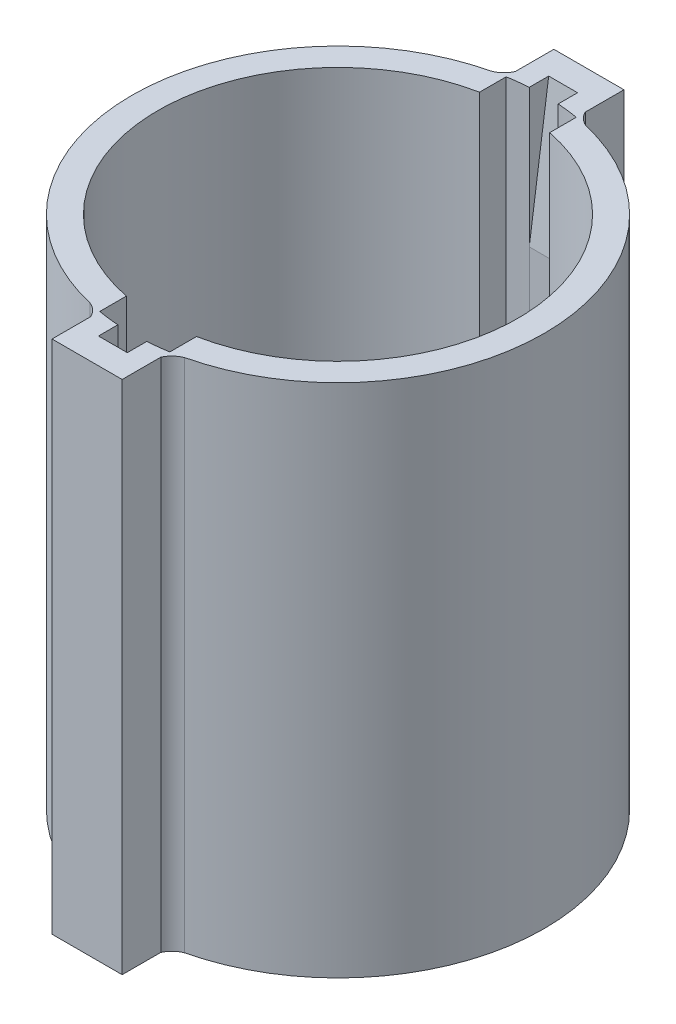
ISO-10303-21;
HEADER;
FILE_DESCRIPTION(('STEP AP214'),'2;1');
FILE_NAME('part.step','',(''),(''),'','','');
FILE_SCHEMA(('AUTOMOTIVE_DESIGN { 1 0 10303 214 1 1 1 1 }'));
ENDSEC;
DATA;
#1=APPLICATION_CONTEXT('core data for automotive mechanical design processes');
#2=APPLICATION_PROTOCOL_DEFINITION('international standard','automotive_design',2000,#1);
#3=PRODUCT_CONTEXT('',#1,'mechanical');
#4=PRODUCT('Part','Part','',(#3));
#5=PRODUCT_RELATED_PRODUCT_CATEGORY('part','',(#4));
#6=PRODUCT_DEFINITION_FORMATION('','',#4);
#7=PRODUCT_DEFINITION_CONTEXT('part definition',#1,'design');
#8=PRODUCT_DEFINITION('design','',#6,#7);
#9=PRODUCT_DEFINITION_SHAPE('','',#8);
#10=(LENGTH_UNIT() NAMED_UNIT(*) SI_UNIT(.MILLI.,.METRE.));
#11=(NAMED_UNIT(*) PLANE_ANGLE_UNIT() SI_UNIT($,.RADIAN.));
#12=(NAMED_UNIT(*) SI_UNIT($,.STERADIAN.) SOLID_ANGLE_UNIT());
#13=UNCERTAINTY_MEASURE_WITH_UNIT(LENGTH_MEASURE(1.E-05),#10,'distance_accuracy_value','');
#14=(GEOMETRIC_REPRESENTATION_CONTEXT(3) GLOBAL_UNCERTAINTY_ASSIGNED_CONTEXT((#13)) GLOBAL_UNIT_ASSIGNED_CONTEXT((#10,
#11,#12)) REPRESENTATION_CONTEXT('',''));
#15=CARTESIAN_POINT('',(0.,0.,0.));
#16=DIRECTION('',(0.,0.,1.));
#17=DIRECTION('',(1.,0.,0.));
#18=AXIS2_PLACEMENT_3D('',#15,#16,#17);
#19=CARTESIAN_POINT('',(-1.4,50.,0.));
#20=DIRECTION('',(1.,0.,0.));
#21=DIRECTION('',(0.,0.,-1.));
#22=AXIS2_PLACEMENT_3D('',#19,#20,#21);
#23=PLANE('',#22);
#24=DIRECTION('',(0.,-1.,0.));
#25=VECTOR('',#24,1.);
#26=CARTESIAN_POINT('',(-1.4,50.,-19.9509398274868));
#27=LINE('',#26,#25);
#28=CARTESIAN_POINT('',(-1.4,50.,-19.9509398274868));
#29=VERTEX_POINT('',#28);
#30=CARTESIAN_POINT('',(-1.4,36.5942152933488,-19.9509398274868));
#31=VERTEX_POINT('',#30);
#32=EDGE_CURVE('E369',#29,#31,#27,.T.);
#33=ORIENTED_EDGE('',*,*,#32,.T.);
#34=DIRECTION('',(0.,-0.990268068741572,0.139173100960055));
#35=VECTOR('',#34,1.);
#36=CARTESIAN_POINT('',(-1.4,-2.04081323058998,-14.5211406699822));
#37=LINE('',#36,#35);
#38=CARTESIAN_POINT('',(-1.4,50.,-21.835));
#39=VERTEX_POINT('',#38);
#40=EDGE_CURVE('E510',#39,#31,#37,.T.);
#41=ORIENTED_EDGE('',*,*,#40,.F.);
#42=DIRECTION('',(0.,0.,1.));
#43=VECTOR('',#42,1.);
#44=CARTESIAN_POINT('',(-1.4,50.,0.));
#45=LINE('',#44,#43);
#46=EDGE_CURVE('E411',#39,#29,#45,.T.);
#47=ORIENTED_EDGE('',*,*,#46,.T.);
#48=EDGE_LOOP('',(#33,#41,#47));
#49=FACE_BOUND('',#48,.T.);
#50=ADVANCED_FACE('F45',(#49),#23,.T.);
#51=CARTESIAN_POINT('',(1.4,50.,0.));
#52=DIRECTION('',(1.,0.,0.));
#53=DIRECTION('',(0.,0.,-1.));
#54=AXIS2_PLACEMENT_3D('',#51,#52,#53);
#55=PLANE('',#54);
#56=DIRECTION('',(0.,-0.990268068741572,0.139173100960055));
#57=VECTOR('',#56,1.);
#58=CARTESIAN_POINT('',(1.4,-2.04081323058998,-14.5211406699822));
#59=LINE('',#58,#57);
#60=CARTESIAN_POINT('',(1.4,50.,-21.835));
#61=VERTEX_POINT('',#60);
#62=CARTESIAN_POINT('',(1.4,36.5942152933488,-19.9509398274868));
#63=VERTEX_POINT('',#62);
#64=EDGE_CURVE('E471',#61,#63,#59,.T.);
#65=ORIENTED_EDGE('',*,*,#64,.T.);
#66=DIRECTION('',(0.,-1.,0.));
#67=VECTOR('',#66,1.);
#68=CARTESIAN_POINT('',(1.4,50.,-19.9509398274868));
#69=LINE('',#68,#67);
#70=CARTESIAN_POINT('',(1.4,50.,-19.9509398274868));
#71=VERTEX_POINT('',#70);
#72=EDGE_CURVE('E365',#71,#63,#69,.T.);
#73=ORIENTED_EDGE('',*,*,#72,.F.);
#74=DIRECTION('',(0.,0.,1.));
#75=VECTOR('',#74,1.);
#76=CARTESIAN_POINT('',(1.4,50.,0.));
#77=LINE('',#76,#75);
#78=EDGE_CURVE('E446',#61,#71,#77,.T.);
#79=ORIENTED_EDGE('',*,*,#78,.F.);
#80=EDGE_LOOP('',(#65,#73,#79));
#81=FACE_BOUND('',#80,.T.);
#82=ADVANCED_FACE('F470',(#81),#55,.F.);
#83=CARTESIAN_POINT('',(5.37543644040511,50.,-21.492012876502));
#84=DIRECTION('',(0.,-1.,0.));
#85=DIRECTION('',(0.,0.,-1.));
#86=AXIS2_PLACEMENT_3D('',#83,#84,#85);
#87=CYLINDRICAL_SURFACE('',#86,2.17157334339546);
#88=CARTESIAN_POINT('',(5.37543644040511,0.,-21.492012876502));
#89=DIRECTION('',(0.,1.,0.));
#90=DIRECTION('',(0.,0.,1.));
#91=AXIS2_PLACEMENT_3D('',#88,#89,#90);
#92=CIRCLE('',#91,2.17157334339546);
#93=CARTESIAN_POINT('',(3.4,0.,-20.5901361356636));
#94=VERTEX_POINT('',#93);
#95=CARTESIAN_POINT('',(4.59859783324551,0.,-19.4641439053473));
#96=VERTEX_POINT('',#95);
#97=EDGE_CURVE('E250',#94,#96,#92,.T.);
#98=ORIENTED_EDGE('',*,*,#97,.F.);
#99=DIRECTION('',(0.,-1.,0.));
#100=VECTOR('',#99,1.);
#101=CARTESIAN_POINT('',(3.4,50.,-20.5901361356636));
#102=LINE('',#101,#100);
#103=CARTESIAN_POINT('',(3.4,50.,-20.5901361356636));
#104=VERTEX_POINT('',#103);
#105=EDGE_CURVE('E11',#104,#94,#102,.T.);
#106=ORIENTED_EDGE('',*,*,#105,.F.);
#107=CARTESIAN_POINT('',(5.37543644040511,50.,-21.492012876502));
#108=DIRECTION('',(0.,1.,0.));
#109=DIRECTION('',(0.,0.,1.));
#110=AXIS2_PLACEMENT_3D('',#107,#108,#109);
#111=CIRCLE('',#110,2.17157334339546);
#112=CARTESIAN_POINT('',(4.59859783324551,50.,-19.4641439053473));
#113=VERTEX_POINT('',#112);
#114=EDGE_CURVE('E520',#104,#113,#111,.T.);
#115=ORIENTED_EDGE('',*,*,#114,.T.);
#116=DIRECTION('',(0.,-1.,0.));
#117=VECTOR('',#116,1.);
#118=CARTESIAN_POINT('',(4.59859783324551,50.,-19.4641439053473));
#119=LINE('',#118,#117);
#120=EDGE_CURVE('E140',#113,#96,#119,.T.);
#121=ORIENTED_EDGE('',*,*,#120,.T.);
#122=EDGE_LOOP('',(#98,#106,#115,#121));
#123=FACE_BOUND('',#122,.T.);
#124=ADVANCED_FACE('F574',(#123),#87,.F.);
#125=CARTESIAN_POINT('',(3.4,50.,0.));
#126=DIRECTION('',(1.,0.,0.));
#127=DIRECTION('',(0.,0.,-1.));
#128=AXIS2_PLACEMENT_3D('',#125,#126,#127);
#129=PLANE('',#128);
#130=DIRECTION('',(0.,0.,1.));
#131=VECTOR('',#130,1.);
#132=CARTESIAN_POINT('',(3.4,0.,0.));
#133=LINE('',#132,#131);
#134=CARTESIAN_POINT('',(3.4,0.,-24.335));
#135=VERTEX_POINT('',#134);
#136=EDGE_CURVE('E277',#135,#94,#133,.T.);
#137=ORIENTED_EDGE('',*,*,#136,.F.);
#138=DIRECTION('',(0.,-1.,0.));
#139=VECTOR('',#138,1.);
#140=CARTESIAN_POINT('',(3.4,50.,-24.335));
#141=LINE('',#140,#139);
#142=CARTESIAN_POINT('',(3.4,50.,-24.335));
#143=VERTEX_POINT('',#142);
#144=EDGE_CURVE('E56',#143,#135,#141,.T.);
#145=ORIENTED_EDGE('',*,*,#144,.F.);
#146=DIRECTION('',(0.,0.,1.));
#147=VECTOR('',#146,1.);
#148=CARTESIAN_POINT('',(3.4,50.,0.));
#149=LINE('',#148,#147);
#150=EDGE_CURVE('E523',#143,#104,#149,.T.);
#151=ORIENTED_EDGE('',*,*,#150,.T.);
#152=ORIENTED_EDGE('',*,*,#105,.T.);
#153=EDGE_LOOP('',(#137,#145,#151,#152));
#154=FACE_BOUND('',#153,.T.);
#155=ADVANCED_FACE('F617',(#154),#129,.T.);
#156=CARTESIAN_POINT('',(0.,50.,-24.335));
#157=DIRECTION('',(0.,0.,-1.));
#158=DIRECTION('',(-1.,0.,0.));
#159=AXIS2_PLACEMENT_3D('',#156,#157,#158);
#160=PLANE('',#159);
#161=DIRECTION('',(1.,0.,0.));
#162=VECTOR('',#161,1.);
#163=CARTESIAN_POINT('',(0.,0.,-24.335));
#164=LINE('',#163,#162);
#165=CARTESIAN_POINT('',(-3.4,0.,-24.335));
#166=VERTEX_POINT('',#165);
#167=EDGE_CURVE('E281',#166,#135,#164,.T.);
#168=ORIENTED_EDGE('',*,*,#167,.F.);
#169=DIRECTION('',(0.,-1.,0.));
#170=VECTOR('',#169,1.);
#171=CARTESIAN_POINT('',(-3.4,50.,-24.335));
#172=LINE('',#171,#170);
#173=CARTESIAN_POINT('',(-3.4,50.,-24.335));
#174=VERTEX_POINT('',#173);
#175=EDGE_CURVE('E341',#174,#166,#172,.T.);
#176=ORIENTED_EDGE('',*,*,#175,.F.);
#177=DIRECTION('',(1.,0.,0.));
#178=VECTOR('',#177,1.);
#179=CARTESIAN_POINT('',(0.,50.,-24.335));
#180=LINE('',#179,#178);
#181=EDGE_CURVE('E529',#174,#143,#180,.T.);
#182=ORIENTED_EDGE('',*,*,#181,.T.);
#183=ORIENTED_EDGE('',*,*,#144,.T.);
#184=EDGE_LOOP('',(#168,#176,#182,#183));
#185=FACE_BOUND('',#184,.T.);
#186=ADVANCED_FACE('F613',(#185),#160,.T.);
#187=CARTESIAN_POINT('',(-3.4,50.,0.));
#188=DIRECTION('',(1.,0.,0.));
#189=DIRECTION('',(0.,0.,-1.));
#190=AXIS2_PLACEMENT_3D('',#187,#188,#189);
#191=PLANE('',#190);
#192=DIRECTION('',(0.,0.,1.));
#193=VECTOR('',#192,1.);
#194=CARTESIAN_POINT('',(-3.4,0.,0.));
#195=LINE('',#194,#193);
#196=CARTESIAN_POINT('',(-3.4,0.,-20.5901361356636));
#197=VERTEX_POINT('',#196);
#198=EDGE_CURVE('E285',#166,#197,#195,.T.);
#199=ORIENTED_EDGE('',*,*,#198,.T.);
#200=DIRECTION('',(0.,-1.,0.));
#201=VECTOR('',#200,1.);
#202=CARTESIAN_POINT('',(-3.4,50.,-20.5901361356636));
#203=LINE('',#202,#201);
#204=CARTESIAN_POINT('',(-3.4,50.,-20.5901361356636));
#205=VERTEX_POINT('',#204);
#206=EDGE_CURVE('E337',#205,#197,#203,.T.);
#207=ORIENTED_EDGE('',*,*,#206,.F.);
#208=DIRECTION('',(0.,0.,1.));
#209=VECTOR('',#208,1.);
#210=CARTESIAN_POINT('',(-3.4,50.,0.));
#211=LINE('',#210,#209);
#212=EDGE_CURVE('E533',#174,#205,#211,.T.);
#213=ORIENTED_EDGE('',*,*,#212,.F.);
#214=ORIENTED_EDGE('',*,*,#175,.T.);
#215=EDGE_LOOP('',(#199,#207,#213,#214));
#216=FACE_BOUND('',#215,.T.);
#217=ADVANCED_FACE('F609',(#216),#191,.F.);
#218=CARTESIAN_POINT('',(-5.37543644040511,50.,-21.492012876502));
#219=DIRECTION('',(0.,-1.,0.));
#220=DIRECTION('',(0.,0.,-1.));
#221=AXIS2_PLACEMENT_3D('',#218,#219,#220);
#222=CYLINDRICAL_SURFACE('',#221,2.17157334339546);
#223=CARTESIAN_POINT('',(-5.37543644040511,0.,-21.492012876502));
#224=DIRECTION('',(0.,1.,0.));
#225=DIRECTION('',(0.,0.,1.));
#226=AXIS2_PLACEMENT_3D('',#223,#224,#225);
#227=CIRCLE('',#226,2.17157334339546);
#228=CARTESIAN_POINT('',(-4.59859783324551,0.,-19.4641439053473));
#229=VERTEX_POINT('',#228);
#230=EDGE_CURVE('E289',#197,#229,#227,.F.);
#231=ORIENTED_EDGE('',*,*,#230,.T.);
#232=DIRECTION('',(0.,-1.,0.));
#233=VECTOR('',#232,1.);
#234=CARTESIAN_POINT('',(-4.59859783324551,50.,-19.4641439053473));
#235=LINE('',#234,#233);
#236=CARTESIAN_POINT('',(-4.59859783324551,50.,-19.4641439053473));
#237=VERTEX_POINT('',#236);
#238=EDGE_CURVE('E333',#237,#229,#235,.T.);
#239=ORIENTED_EDGE('',*,*,#238,.F.);
#240=CARTESIAN_POINT('',(-5.37543644040511,50.,-21.492012876502));
#241=DIRECTION('',(0.,1.,0.));
#242=DIRECTION('',(0.,0.,1.));
#243=AXIS2_PLACEMENT_3D('',#240,#241,#242);
#244=CIRCLE('',#243,2.17157334339546);
#245=EDGE_CURVE('E537',#205,#237,#244,.F.);
#246=ORIENTED_EDGE('',*,*,#245,.F.);
#247=ORIENTED_EDGE('',*,*,#206,.T.);
#248=EDGE_LOOP('',(#231,#239,#246,#247));
#249=FACE_BOUND('',#248,.T.);
#250=ADVANCED_FACE('F605',(#249),#222,.F.);
#251=CARTESIAN_POINT('',(0.,50.,0.));
#252=DIRECTION('',(0.,-1.,0.));
#253=DIRECTION('',(0.,0.,-1.));
#254=AXIS2_PLACEMENT_3D('',#251,#252,#253);
#255=CYLINDRICAL_SURFACE('',#254,20.);
#256=CARTESIAN_POINT('',(0.,0.,0.));
#257=DIRECTION('',(0.,1.,0.));
#258=DIRECTION('',(0.,0.,1.));
#259=AXIS2_PLACEMENT_3D('',#256,#257,#258);
#260=CIRCLE('',#259,20.);
#261=CARTESIAN_POINT('',(-4.59859783324536,0.,19.4641439053474));
#262=VERTEX_POINT('',#261);
#263=EDGE_CURVE('E293',#229,#262,#260,.T.);
#264=ORIENTED_EDGE('',*,*,#263,.T.);
#265=DIRECTION('',(0.,-1.,0.));
#266=VECTOR('',#265,1.);
#267=CARTESIAN_POINT('',(-4.59859783324536,50.,19.4641439053474));
#268=LINE('',#267,#266);
#269=CARTESIAN_POINT('',(-4.59859783324536,50.,19.4641439053474));
#270=VERTEX_POINT('',#269);
#271=EDGE_CURVE('E330',#270,#262,#268,.T.);
#272=ORIENTED_EDGE('',*,*,#271,.F.);
#273=CARTESIAN_POINT('',(0.,50.,0.));
#274=DIRECTION('',(0.,1.,0.));
#275=DIRECTION('',(0.,0.,1.));
#276=AXIS2_PLACEMENT_3D('',#273,#274,#275);
#277=CIRCLE('',#276,20.);
#278=EDGE_CURVE('E541',#237,#270,#277,.T.);
#279=ORIENTED_EDGE('',*,*,#278,.F.);
#280=ORIENTED_EDGE('',*,*,#238,.T.);
#281=EDGE_LOOP('',(#264,#272,#279,#280));
#282=FACE_BOUND('',#281,.T.);
#283=ADVANCED_FACE('F601',(#282),#255,.T.);
#284=CARTESIAN_POINT('',(-5.37543644040494,50.,21.4920128765021));
#285=DIRECTION('',(0.,-1.,0.));
#286=DIRECTION('',(0.,0.,-1.));
#287=AXIS2_PLACEMENT_3D('',#284,#285,#286);
#288=CYLINDRICAL_SURFACE('',#287,2.17157334339546);
#289=CARTESIAN_POINT('',(-5.37543644040494,0.,21.4920128765021));
#290=DIRECTION('',(0.,1.,0.));
#291=DIRECTION('',(0.,0.,1.));
#292=AXIS2_PLACEMENT_3D('',#289,#290,#291);
#293=CIRCLE('',#292,2.17157334339546);
#294=CARTESIAN_POINT('',(-3.4,0.,20.5901361356633));
#295=VERTEX_POINT('',#294);
#296=EDGE_CURVE('E297',#295,#262,#293,.T.);
#297=ORIENTED_EDGE('',*,*,#296,.F.);
#298=DIRECTION('',(0.,-1.,0.));
#299=VECTOR('',#298,1.);
#300=CARTESIAN_POINT('',(-3.4,50.,20.5901361356633));
#301=LINE('',#300,#299);
#302=CARTESIAN_POINT('',(-3.4,50.,20.5901361356633));
#303=VERTEX_POINT('',#302);
#304=EDGE_CURVE('E327',#303,#295,#301,.T.);
#305=ORIENTED_EDGE('',*,*,#304,.F.);
#306=CARTESIAN_POINT('',(-5.37543644040494,50.,21.4920128765021));
#307=DIRECTION('',(0.,1.,0.));
#308=DIRECTION('',(0.,0.,1.));
#309=AXIS2_PLACEMENT_3D('',#306,#307,#308);
#310=CIRCLE('',#309,2.17157334339546);
#311=EDGE_CURVE('E544',#303,#270,#310,.T.);
#312=ORIENTED_EDGE('',*,*,#311,.T.);
#313=ORIENTED_EDGE('',*,*,#271,.T.);
#314=EDGE_LOOP('',(#297,#305,#312,#313));
#315=FACE_BOUND('',#314,.T.);
#316=ADVANCED_FACE('F598',(#315),#288,.F.);
#317=CARTESIAN_POINT('',(-3.4,50.,0.));
#318=DIRECTION('',(1.,0.,0.));
#319=DIRECTION('',(0.,0.,-1.));
#320=AXIS2_PLACEMENT_3D('',#317,#318,#319);
#321=PLANE('',#320);
#322=DIRECTION('',(0.,0.,1.));
#323=VECTOR('',#322,1.);
#324=CARTESIAN_POINT('',(-3.4,0.,0.));
#325=LINE('',#324,#323);
#326=CARTESIAN_POINT('',(-3.4,0.,24.335));
#327=VERTEX_POINT('',#326);
#328=EDGE_CURVE('E301',#295,#327,#325,.T.);
#329=ORIENTED_EDGE('',*,*,#328,.T.);
#330=DIRECTION('',(0.,-1.,0.));
#331=VECTOR('',#330,1.);
#332=CARTESIAN_POINT('',(-3.4,50.,24.335));
#333=LINE('',#332,#331);
#334=CARTESIAN_POINT('',(-3.4,50.,24.335));
#335=VERTEX_POINT('',#334);
#336=EDGE_CURVE('E323',#335,#327,#333,.T.);
#337=ORIENTED_EDGE('',*,*,#336,.F.);
#338=DIRECTION('',(0.,0.,1.));
#339=VECTOR('',#338,1.);
#340=CARTESIAN_POINT('',(-3.4,50.,0.));
#341=LINE('',#340,#339);
#342=EDGE_CURVE('E239',#303,#335,#341,.T.);
#343=ORIENTED_EDGE('',*,*,#342,.F.);
#344=ORIENTED_EDGE('',*,*,#304,.T.);
#345=EDGE_LOOP('',(#329,#337,#343,#344));
#346=FACE_BOUND('',#345,.T.);
#347=ADVANCED_FACE('F552',(#346),#321,.F.);
#348=CARTESIAN_POINT('',(0.,50.,24.335));
#349=DIRECTION('',(0.,0.,-1.));
#350=DIRECTION('',(-1.,0.,0.));
#351=AXIS2_PLACEMENT_3D('',#348,#349,#350);
#352=PLANE('',#351);
#353=DIRECTION('',(1.,0.,0.));
#354=VECTOR('',#353,1.);
#355=CARTESIAN_POINT('',(0.,0.,24.335));
#356=LINE('',#355,#354);
#357=CARTESIAN_POINT('',(3.4,0.,24.335));
#358=VERTEX_POINT('',#357);
#359=EDGE_CURVE('E305',#327,#358,#356,.T.);
#360=ORIENTED_EDGE('',*,*,#359,.T.);
#361=DIRECTION('',(0.,-1.,0.));
#362=VECTOR('',#361,1.);
#363=CARTESIAN_POINT('',(3.4,50.,24.335));
#364=LINE('',#363,#362);
#365=CARTESIAN_POINT('',(3.4,50.,24.335));
#366=VERTEX_POINT('',#365);
#367=EDGE_CURVE('E224',#366,#358,#364,.T.);
#368=ORIENTED_EDGE('',*,*,#367,.F.);
#369=DIRECTION('',(1.,0.,0.));
#370=VECTOR('',#369,1.);
#371=CARTESIAN_POINT('',(0.,50.,24.335));
#372=LINE('',#371,#370);
#373=EDGE_CURVE('E234',#335,#366,#372,.T.);
#374=ORIENTED_EDGE('',*,*,#373,.F.);
#375=ORIENTED_EDGE('',*,*,#336,.T.);
#376=EDGE_LOOP('',(#360,#368,#374,#375));
#377=FACE_BOUND('',#376,.T.);
#378=ADVANCED_FACE('F555',(#377),#352,.F.);
#379=CARTESIAN_POINT('',(3.4,50.,0.));
#380=DIRECTION('',(1.,0.,0.));
#381=DIRECTION('',(0.,0.,-1.));
#382=AXIS2_PLACEMENT_3D('',#379,#380,#381);
#383=PLANE('',#382);
#384=DIRECTION('',(0.,0.,1.));
#385=VECTOR('',#384,1.);
#386=CARTESIAN_POINT('',(3.4,0.,0.));
#387=LINE('',#386,#385);
#388=CARTESIAN_POINT('',(3.4,0.,20.5901361356639));
#389=VERTEX_POINT('',#388);
#390=EDGE_CURVE('E220',#389,#358,#387,.T.);
#391=ORIENTED_EDGE('',*,*,#390,.F.);
#392=DIRECTION('',(0.,-1.,0.));
#393=VECTOR('',#392,1.);
#394=CARTESIAN_POINT('',(3.4,50.,20.5901361356639));
#395=LINE('',#394,#393);
#396=CARTESIAN_POINT('',(3.4,50.,20.5901361356639));
#397=VERTEX_POINT('',#396);
#398=EDGE_CURVE('E214',#397,#389,#395,.T.);
#399=ORIENTED_EDGE('',*,*,#398,.F.);
#400=DIRECTION('',(0.,0.,1.));
#401=VECTOR('',#400,1.);
#402=CARTESIAN_POINT('',(3.4,50.,0.));
#403=LINE('',#402,#401);
#404=EDGE_CURVE('E218',#397,#366,#403,.T.);
#405=ORIENTED_EDGE('',*,*,#404,.T.);
#406=ORIENTED_EDGE('',*,*,#367,.T.);
#407=EDGE_LOOP('',(#391,#399,#405,#406));
#408=FACE_BOUND('',#407,.T.);
#409=ADVANCED_FACE('F216',(#408),#383,.T.);
#410=CARTESIAN_POINT('',(5.37543644040527,50.,21.492012876502));
#411=DIRECTION('',(0.,-1.,0.));
#412=DIRECTION('',(0.,0.,-1.));
#413=AXIS2_PLACEMENT_3D('',#410,#411,#412);
#414=CYLINDRICAL_SURFACE('',#413,2.17157334339546);
#415=CARTESIAN_POINT('',(5.37543644040527,0.,21.492012876502));
#416=DIRECTION('',(0.,1.,0.));
#417=DIRECTION('',(0.,0.,1.));
#418=AXIS2_PLACEMENT_3D('',#415,#416,#417);
#419=CIRCLE('',#418,2.17157334339546);
#420=CARTESIAN_POINT('',(4.59859783324565,0.,19.4641439053473));
#421=VERTEX_POINT('',#420);
#422=EDGE_CURVE('E311',#389,#421,#419,.F.);
#423=ORIENTED_EDGE('',*,*,#422,.T.);
#424=DIRECTION('',(0.,-1.,0.));
#425=VECTOR('',#424,1.);
#426=CARTESIAN_POINT('',(4.59859783324565,50.,19.4641439053473));
#427=LINE('',#426,#425);
#428=CARTESIAN_POINT('',(4.59859783324565,50.,19.4641439053473));
#429=VERTEX_POINT('',#428);
#430=EDGE_CURVE('E225',#429,#421,#427,.T.);
#431=ORIENTED_EDGE('',*,*,#430,.F.);
#432=CARTESIAN_POINT('',(5.37543644040527,50.,21.492012876502));
#433=DIRECTION('',(0.,1.,0.));
#434=DIRECTION('',(0.,0.,1.));
#435=AXIS2_PLACEMENT_3D('',#432,#433,#434);
#436=CIRCLE('',#435,2.17157334339546);
#437=EDGE_CURVE('E228',#397,#429,#436,.F.);
#438=ORIENTED_EDGE('',*,*,#437,.F.);
#439=ORIENTED_EDGE('',*,*,#398,.T.);
#440=EDGE_LOOP('',(#423,#431,#438,#439));
#441=FACE_BOUND('',#440,.T.);
#442=ADVANCED_FACE('F229',(#441),#414,.F.);
#443=CARTESIAN_POINT('',(-3.4,50.,0.));
#444=DIRECTION('',(1.,0.,0.));
#445=DIRECTION('',(0.,0.,-1.));
#446=AXIS2_PLACEMENT_3D('',#443,#444,#445);
#447=PLANE('',#446);
#448=DIRECTION('',(0.,0.,1.));
#449=VECTOR('',#448,1.);
#450=CARTESIAN_POINT('',(-3.4,0.,0.));
#451=LINE('',#450,#449);
#452=CARTESIAN_POINT('',(-3.4,0.,17.1257583773683));
#453=VERTEX_POINT('',#452);
#454=CARTESIAN_POINT('',(-3.4,0.,19.7088812467882));
#455=VERTEX_POINT('',#454);
#456=EDGE_CURVE('E252',#453,#455,#451,.T.);
#457=ORIENTED_EDGE('',*,*,#456,.F.);
#458=DIRECTION('',(0.,-1.,0.));
#459=VECTOR('',#458,1.);
#460=CARTESIAN_POINT('',(-3.4,50.,17.1257583773683));
#461=LINE('',#460,#459);
#462=CARTESIAN_POINT('',(-3.4,50.,17.1257583773683));
#463=VERTEX_POINT('',#462);
#464=EDGE_CURVE('E378',#463,#453,#461,.T.);
#465=ORIENTED_EDGE('',*,*,#464,.F.);
#466=DIRECTION('',(0.,0.,1.));
#467=VECTOR('',#466,1.);
#468=CARTESIAN_POINT('',(-3.4,50.,0.));
#469=LINE('',#468,#467);
#470=CARTESIAN_POINT('',(-3.4,50.,19.7088812467882));
#471=VERTEX_POINT('',#470);
#472=EDGE_CURVE('E389',#463,#471,#469,.T.);
#473=ORIENTED_EDGE('',*,*,#472,.T.);
#474=DIRECTION('',(0.,-1.,0.));
#475=VECTOR('',#474,1.);
#476=CARTESIAN_POINT('',(-3.4,50.,19.7088812467882));
#477=LINE('',#476,#475);
#478=EDGE_CURVE('E49',#471,#455,#477,.T.);
#479=ORIENTED_EDGE('',*,*,#478,.T.);
#480=EDGE_LOOP('',(#457,#465,#473,#479));
#481=FACE_BOUND('',#480,.T.);
#482=ADVANCED_FACE('F387',(#481),#447,.T.);
#483=CARTESIAN_POINT('',(0.,50.,0.));
#484=DIRECTION('',(0.,-1.,0.));
#485=DIRECTION('',(0.,0.,-1.));
#486=AXIS2_PLACEMENT_3D('',#483,#484,#485);
#487=CYLINDRICAL_SURFACE('',#486,17.46);
#488=CARTESIAN_POINT('',(0.,0.,0.));
#489=DIRECTION('',(0.,1.,0.));
#490=DIRECTION('',(0.,0.,1.));
#491=AXIS2_PLACEMENT_3D('',#488,#489,#490);
#492=CIRCLE('',#491,17.46);
#493=CARTESIAN_POINT('',(-3.4,0.,-17.1257583773683));
#494=VERTEX_POINT('',#493);
#495=EDGE_CURVE('E256',#494,#453,#492,.T.);
#496=ORIENTED_EDGE('',*,*,#495,.F.);
#497=DIRECTION('',(0.,-1.,0.));
#498=VECTOR('',#497,1.);
#499=CARTESIAN_POINT('',(-3.4,50.,-17.1257583773683));
#500=LINE('',#499,#498);
#501=CARTESIAN_POINT('',(-3.4,50.,-17.1257583773683));
#502=VERTEX_POINT('',#501);
#503=EDGE_CURVE('E376',#502,#494,#500,.T.);
#504=ORIENTED_EDGE('',*,*,#503,.F.);
#505=CARTESIAN_POINT('',(0.,50.,0.));
#506=DIRECTION('',(0.,1.,0.));
#507=DIRECTION('',(0.,0.,1.));
#508=AXIS2_PLACEMENT_3D('',#505,#506,#507);
#509=CIRCLE('',#508,17.46);
#510=EDGE_CURVE('E396',#502,#463,#509,.T.);
#511=ORIENTED_EDGE('',*,*,#510,.T.);
#512=ORIENTED_EDGE('',*,*,#464,.T.);
#513=EDGE_LOOP('',(#496,#504,#511,#512));
#514=FACE_BOUND('',#513,.T.);
#515=ADVANCED_FACE('F47',(#514),#487,.F.);
#516=CARTESIAN_POINT('',(-3.4,0.,-19.7088812467882));
#517=VERTEX_POINT('',#516);
#518=EDGE_CURVE('E258',#517,#494,#451,.T.);
#519=ORIENTED_EDGE('',*,*,#518,.F.);
#520=DIRECTION('',(0.,-1.,0.));
#521=VECTOR('',#520,1.);
#522=CARTESIAN_POINT('',(-3.4,50.,-19.7088812467882));
#523=LINE('',#522,#521);
#524=CARTESIAN_POINT('',(-3.4,50.,-19.7088812467882));
#525=VERTEX_POINT('',#524);
#526=EDGE_CURVE('E373',#525,#517,#523,.T.);
#527=ORIENTED_EDGE('',*,*,#526,.F.);
#528=EDGE_CURVE('E402',#525,#502,#469,.T.);
#529=ORIENTED_EDGE('',*,*,#528,.T.);
#530=ORIENTED_EDGE('',*,*,#503,.T.);
#531=EDGE_LOOP('',(#519,#527,#529,#530));
#532=FACE_BOUND('',#531,.T.);
#533=ADVANCED_FACE('F406',(#532),#447,.T.);
#534=CARTESIAN_POINT('',(0.,50.,0.));
#535=DIRECTION('',(0.,-1.,0.));
#536=DIRECTION('',(0.,0.,-1.));
#537=AXIS2_PLACEMENT_3D('',#534,#535,#536);
#538=CYLINDRICAL_SURFACE('',#537,20.);
#539=CARTESIAN_POINT('',(0.,0.,0.));
#540=DIRECTION('',(0.,1.,0.));
#541=DIRECTION('',(0.,0.,1.));
#542=AXIS2_PLACEMENT_3D('',#539,#540,#541);
#543=CIRCLE('',#542,20.);
#544=CARTESIAN_POINT('',(-1.4,0.,-19.9509398274868));
#545=VERTEX_POINT('',#544);
#546=EDGE_CURVE('E262',#545,#517,#543,.T.);
#547=ORIENTED_EDGE('',*,*,#546,.F.);
#548=DIRECTION('',(0.,-1.,0.));
#549=VECTOR('',#548,1.);
#550=CARTESIAN_POINT('',(-1.4,0.,-19.9509398274868));
#551=LINE('',#550,#549);
#552=EDGE_CURVE('E659',#31,#545,#551,.T.);
#553=ORIENTED_EDGE('',*,*,#552,.F.);
#554=ORIENTED_EDGE('',*,*,#32,.F.);
#555=CARTESIAN_POINT('',(0.,50.,0.));
#556=DIRECTION('',(0.,1.,0.));
#557=DIRECTION('',(0.,0.,1.));
#558=AXIS2_PLACEMENT_3D('',#555,#556,#557);
#559=CIRCLE('',#558,20.);
#560=EDGE_CURVE('E408',#29,#525,#559,.T.);
#561=ORIENTED_EDGE('',*,*,#560,.T.);
#562=ORIENTED_EDGE('',*,*,#526,.T.);
#563=EDGE_LOOP('',(#547,#553,#554,#561,#562));
#564=FACE_BOUND('',#563,.T.);
#565=ADVANCED_FACE('F578',(#564),#538,.F.);
#566=CARTESIAN_POINT('',(3.4,0.,-19.7088812467882));
#567=VERTEX_POINT('',#566);
#568=CARTESIAN_POINT('',(1.4,0.,-19.9509398274868));
#569=VERTEX_POINT('',#568);
#570=EDGE_CURVE('E266',#567,#569,#543,.T.);
#571=ORIENTED_EDGE('',*,*,#570,.F.);
#572=DIRECTION('',(0.,-1.,0.));
#573=VECTOR('',#572,1.);
#574=CARTESIAN_POINT('',(3.4,50.,-19.7088812467882));
#575=LINE('',#574,#573);
#576=CARTESIAN_POINT('',(3.4,50.,-19.7088812467882));
#577=VERTEX_POINT('',#576);
#578=EDGE_CURVE('E362',#577,#567,#575,.T.);
#579=ORIENTED_EDGE('',*,*,#578,.F.);
#580=EDGE_CURVE('E413',#577,#71,#559,.T.);
#581=ORIENTED_EDGE('',*,*,#580,.T.);
#582=ORIENTED_EDGE('',*,*,#72,.T.);
#583=DIRECTION('',(0.,-1.,0.));
#584=VECTOR('',#583,1.);
#585=CARTESIAN_POINT('',(1.4,0.,-19.9509398274868));
#586=LINE('',#585,#584);
#587=EDGE_CURVE('E476',#63,#569,#586,.T.);
#588=ORIENTED_EDGE('',*,*,#587,.T.);
#589=EDGE_LOOP('',(#571,#579,#581,#582,#588));
#590=FACE_BOUND('',#589,.T.);
#591=ADVANCED_FACE('F474',(#590),#538,.F.);
#592=CARTESIAN_POINT('',(3.4,50.,0.));
#593=DIRECTION('',(1.,0.,0.));
#594=DIRECTION('',(0.,0.,-1.));
#595=AXIS2_PLACEMENT_3D('',#592,#593,#594);
#596=PLANE('',#595);
#597=DIRECTION('',(0.,0.,1.));
#598=VECTOR('',#597,1.);
#599=CARTESIAN_POINT('',(3.4,0.,0.));
#600=LINE('',#599,#598);
#601=CARTESIAN_POINT('',(3.4,0.,-17.1257583773683));
#602=VERTEX_POINT('',#601);
#603=EDGE_CURVE('E267',#567,#602,#600,.T.);
#604=ORIENTED_EDGE('',*,*,#603,.T.);
#605=DIRECTION('',(0.,-1.,0.));
#606=VECTOR('',#605,1.);
#607=CARTESIAN_POINT('',(3.4,50.,-17.1257583773683));
#608=LINE('',#607,#606);
#609=CARTESIAN_POINT('',(3.4,50.,-17.1257583773683));
#610=VERTEX_POINT('',#609);
#611=EDGE_CURVE('E359',#610,#602,#608,.T.);
#612=ORIENTED_EDGE('',*,*,#611,.F.);
#613=DIRECTION('',(0.,0.,1.));
#614=VECTOR('',#613,1.);
#615=CARTESIAN_POINT('',(3.4,50.,0.));
#616=LINE('',#615,#614);
#617=EDGE_CURVE('E432',#577,#610,#616,.T.);
#618=ORIENTED_EDGE('',*,*,#617,.F.);
#619=ORIENTED_EDGE('',*,*,#578,.T.);
#620=EDGE_LOOP('',(#604,#612,#618,#619));
#621=FACE_BOUND('',#620,.T.);
#622=ADVANCED_FACE('F635',(#621),#596,.F.);
#623=CARTESIAN_POINT('',(0.,50.,0.));
#624=DIRECTION('',(0.,-1.,0.));
#625=DIRECTION('',(0.,0.,-1.));
#626=AXIS2_PLACEMENT_3D('',#623,#624,#625);
#627=CYLINDRICAL_SURFACE('',#626,17.46);
#628=CARTESIAN_POINT('',(0.,0.,0.));
#629=DIRECTION('',(0.,1.,0.));
#630=DIRECTION('',(0.,0.,1.));
#631=AXIS2_PLACEMENT_3D('',#628,#629,#630);
#632=CIRCLE('',#631,17.46);
#633=CARTESIAN_POINT('',(3.4,0.,17.1257583773683));
#634=VERTEX_POINT('',#633);
#635=EDGE_CURVE('E271',#634,#602,#632,.T.);
#636=ORIENTED_EDGE('',*,*,#635,.F.);
#637=DIRECTION('',(0.,-1.,0.));
#638=VECTOR('',#637,1.);
#639=CARTESIAN_POINT('',(3.4,50.,17.1257583773683));
#640=LINE('',#639,#638);
#641=CARTESIAN_POINT('',(3.4,50.,17.1257583773683));
#642=VERTEX_POINT('',#641);
#643=EDGE_CURVE('E356',#642,#634,#640,.T.);
#644=ORIENTED_EDGE('',*,*,#643,.F.);
#645=CARTESIAN_POINT('',(0.,50.,0.));
#646=DIRECTION('',(0.,1.,0.));
#647=DIRECTION('',(0.,0.,1.));
#648=AXIS2_PLACEMENT_3D('',#645,#646,#647);
#649=CIRCLE('',#648,17.46);
#650=EDGE_CURVE('E430',#642,#610,#649,.T.);
#651=ORIENTED_EDGE('',*,*,#650,.T.);
#652=ORIENTED_EDGE('',*,*,#611,.T.);
#653=EDGE_LOOP('',(#636,#644,#651,#652));
#654=FACE_BOUND('',#653,.T.);
#655=ADVANCED_FACE('F633',(#654),#627,.F.);
#656=CARTESIAN_POINT('',(3.4,0.,19.7088812467882));
#657=VERTEX_POINT('',#656);
#658=EDGE_CURVE('E251',#634,#657,#600,.T.);
#659=ORIENTED_EDGE('',*,*,#658,.T.);
#660=DIRECTION('',(0.,-1.,0.));
#661=VECTOR('',#660,1.);
#662=CARTESIAN_POINT('',(3.4,50.,19.7088812467882));
#663=LINE('',#662,#661);
#664=CARTESIAN_POINT('',(3.4,50.,19.7088812467882));
#665=VERTEX_POINT('',#664);
#666=EDGE_CURVE('E353',#665,#657,#663,.T.);
#667=ORIENTED_EDGE('',*,*,#666,.F.);
#668=EDGE_CURVE('E423',#642,#665,#616,.T.);
#669=ORIENTED_EDGE('',*,*,#668,.F.);
#670=ORIENTED_EDGE('',*,*,#643,.T.);
#671=EDGE_LOOP('',(#659,#667,#669,#670));
#672=FACE_BOUND('',#671,.T.);
#673=ADVANCED_FACE('F630',(#672),#596,.F.);
#674=CARTESIAN_POINT('',(0.,50.,0.));
#675=DIRECTION('',(0.,-1.,0.));
#676=DIRECTION('',(0.,0.,-1.));
#677=AXIS2_PLACEMENT_3D('',#674,#675,#676);
#678=CYLINDRICAL_SURFACE('',#677,20.);
#679=CARTESIAN_POINT('',(0.,0.,0.));
#680=DIRECTION('',(0.,1.,0.));
#681=DIRECTION('',(0.,0.,1.));
#682=AXIS2_PLACEMENT_3D('',#679,#680,#681);
#683=CIRCLE('',#682,20.);
#684=EDGE_CURVE('E246',#455,#657,#683,.T.);
#685=ORIENTED_EDGE('',*,*,#684,.F.);
#686=ORIENTED_EDGE('',*,*,#478,.F.);
#687=CARTESIAN_POINT('',(0.,50.,0.));
#688=DIRECTION('',(0.,1.,0.));
#689=DIRECTION('',(0.,0.,1.));
#690=AXIS2_PLACEMENT_3D('',#687,#688,#689);
#691=CIRCLE('',#690,20.);
#692=CARTESIAN_POINT('',(-1.4,50.,19.9509398274868));
#693=VERTEX_POINT('',#692);
#694=EDGE_CURVE('E316',#471,#693,#691,.T.);
#695=ORIENTED_EDGE('',*,*,#694,.T.);
#696=DIRECTION('',(0.,-1.,0.));
#697=VECTOR('',#696,1.);
#698=CARTESIAN_POINT('',(-1.4,50.,19.9509398274868));
#699=LINE('',#698,#697);
#700=CARTESIAN_POINT('',(-1.4,36.5942152933494,19.9509398274868));
#701=VERTEX_POINT('',#700);
#702=EDGE_CURVE('E245',#693,#701,#699,.T.);
#703=ORIENTED_EDGE('',*,*,#702,.T.);
#704=CARTESIAN_POINT('',(0.,-105.364097888263,0.));
#705=DIRECTION('',(0.,0.139173100960062,-0.990268068741571));
#706=DIRECTION('',(0.,-0.990268068741571,-0.139173100960062));
#707=AXIS2_PLACEMENT_3D('',#704,#705,#706);
#708=ELLIPSE('',#707,143.705930686558,20.);
#709=CARTESIAN_POINT('',(1.4,36.5942152933494,19.9509398274868));
#710=VERTEX_POINT('',#709);
#711=EDGE_CURVE('E499',#701,#710,#708,.T.);
#712=ORIENTED_EDGE('',*,*,#711,.T.);
#713=DIRECTION('',(0.,-1.,0.));
#714=VECTOR('',#713,1.);
#715=CARTESIAN_POINT('',(1.4,50.,19.9509398274868));
#716=LINE('',#715,#714);
#717=CARTESIAN_POINT('',(1.4,50.,19.9509398274868));
#718=VERTEX_POINT('',#717);
#719=EDGE_CURVE('E349',#718,#710,#716,.T.);
#720=ORIENTED_EDGE('',*,*,#719,.F.);
#721=EDGE_CURVE('E417',#718,#665,#691,.T.);
#722=ORIENTED_EDGE('',*,*,#721,.T.);
#723=ORIENTED_EDGE('',*,*,#666,.T.);
#724=EDGE_LOOP('',(#685,#686,#695,#703,#712,#720,#722,#723));
#725=FACE_BOUND('',#724,.T.);
#726=ADVANCED_FACE('F500',(#725),#678,.F.);
#727=CARTESIAN_POINT('',(1.4,50.,0.));
#728=DIRECTION('',(1.,0.,0.));
#729=DIRECTION('',(0.,0.,-1.));
#730=AXIS2_PLACEMENT_3D('',#727,#728,#729);
#731=PLANE('',#730);
#732=ORIENTED_EDGE('',*,*,#719,.T.);
#733=DIRECTION('',(0.,-0.990268068741571,-0.139173100960062));
#734=VECTOR('',#733,1.);
#735=CARTESIAN_POINT('',(1.4,-2.04081323059003,14.5211406699818));
#736=LINE('',#735,#734);
#737=CARTESIAN_POINT('',(1.4,50.,21.835));
#738=VERTEX_POINT('',#737);
#739=EDGE_CURVE('E506',#738,#710,#736,.T.);
#740=ORIENTED_EDGE('',*,*,#739,.F.);
#741=DIRECTION('',(0.,0.,1.));
#742=VECTOR('',#741,1.);
#743=CARTESIAN_POINT('',(1.4,50.,0.));
#744=LINE('',#743,#742);
#745=EDGE_CURVE('E422',#718,#738,#744,.T.);
#746=ORIENTED_EDGE('',*,*,#745,.F.);
#747=EDGE_LOOP('',(#732,#740,#746));
#748=FACE_BOUND('',#747,.T.);
#749=ADVANCED_FACE('F512',(#748),#731,.F.);
#750=CARTESIAN_POINT('',(-1.4,50.,0.));
#751=DIRECTION('',(1.,0.,0.));
#752=DIRECTION('',(0.,0.,-1.));
#753=AXIS2_PLACEMENT_3D('',#750,#751,#752);
#754=PLANE('',#753);
#755=DIRECTION('',(0.,-0.990268068741571,-0.139173100960062));
#756=VECTOR('',#755,1.);
#757=CARTESIAN_POINT('',(-1.4,-2.04081323059003,14.5211406699818));
#758=LINE('',#757,#756);
#759=CARTESIAN_POINT('',(-1.4,50.,21.835));
#760=VERTEX_POINT('',#759);
#761=EDGE_CURVE('E504',#760,#701,#758,.T.);
#762=ORIENTED_EDGE('',*,*,#761,.T.);
#763=ORIENTED_EDGE('',*,*,#702,.F.);
#764=DIRECTION('',(0.,0.,1.));
#765=VECTOR('',#764,1.);
#766=CARTESIAN_POINT('',(-1.4,50.,0.));
#767=LINE('',#766,#765);
#768=EDGE_CURVE('E514',#693,#760,#767,.T.);
#769=ORIENTED_EDGE('',*,*,#768,.T.);
#770=EDGE_LOOP('',(#762,#763,#769));
#771=FACE_BOUND('',#770,.T.);
#772=ADVANCED_FACE('F518',(#771),#754,.T.);
#773=CARTESIAN_POINT('',(0.,50.,0.));
#774=DIRECTION('',(0.,-1.,0.));
#775=DIRECTION('',(0.,0.,-1.));
#776=AXIS2_PLACEMENT_3D('',#773,#774,#775);
#777=CYLINDRICAL_SURFACE('',#776,20.);
#778=CARTESIAN_POINT('',(0.,0.,0.));
#779=DIRECTION('',(0.,1.,0.));
#780=DIRECTION('',(0.,0.,1.));
#781=AXIS2_PLACEMENT_3D('',#778,#779,#780);
#782=CIRCLE('',#781,20.);
#783=EDGE_CURVE('E133',#421,#96,#782,.T.);
#784=ORIENTED_EDGE('',*,*,#783,.T.);
#785=ORIENTED_EDGE('',*,*,#120,.F.);
#786=CARTESIAN_POINT('',(0.,50.,0.));
#787=DIRECTION('',(0.,1.,0.));
#788=DIRECTION('',(0.,0.,1.));
#789=AXIS2_PLACEMENT_3D('',#786,#787,#788);
#790=CIRCLE('',#789,20.);
#791=EDGE_CURVE('E65',#429,#113,#790,.T.);
#792=ORIENTED_EDGE('',*,*,#791,.F.);
#793=ORIENTED_EDGE('',*,*,#430,.T.);
#794=EDGE_LOOP('',(#784,#785,#792,#793));
#795=FACE_BOUND('',#794,.T.);
#796=ADVANCED_FACE('F565',(#795),#777,.T.);
#797=CARTESIAN_POINT('',(0.,50.,0.));
#798=DIRECTION('',(0.,1.,0.));
#799=DIRECTION('',(0.,0.,1.));
#800=AXIS2_PLACEMENT_3D('',#797,#798,#799);
#801=PLANE('',#800);
#802=ORIENTED_EDGE('',*,*,#694,.F.);
#803=ORIENTED_EDGE('',*,*,#472,.F.);
#804=ORIENTED_EDGE('',*,*,#510,.F.);
#805=ORIENTED_EDGE('',*,*,#528,.F.);
#806=ORIENTED_EDGE('',*,*,#560,.F.);
#807=ORIENTED_EDGE('',*,*,#46,.F.);
#808=DIRECTION('',(1.,0.,0.));
#809=VECTOR('',#808,1.);
#810=CARTESIAN_POINT('',(0.,50.,-21.835));
#811=LINE('',#810,#809);
#812=EDGE_CURVE('E449',#39,#61,#811,.T.);
#813=ORIENTED_EDGE('',*,*,#812,.T.);
#814=ORIENTED_EDGE('',*,*,#78,.T.);
#815=ORIENTED_EDGE('',*,*,#580,.F.);
#816=ORIENTED_EDGE('',*,*,#617,.T.);
#817=ORIENTED_EDGE('',*,*,#650,.F.);
#818=ORIENTED_EDGE('',*,*,#668,.T.);
#819=ORIENTED_EDGE('',*,*,#721,.F.);
#820=ORIENTED_EDGE('',*,*,#745,.T.);
#821=DIRECTION('',(1.,0.,0.));
#822=VECTOR('',#821,1.);
#823=CARTESIAN_POINT('',(0.,50.,21.835));
#824=LINE('',#823,#822);
#825=EDGE_CURVE('E428',#760,#738,#824,.T.);
#826=ORIENTED_EDGE('',*,*,#825,.F.);
#827=ORIENTED_EDGE('',*,*,#768,.F.);
#828=EDGE_LOOP('',(#802,#803,#804,#805,#806,#807,#813,#814,#815,#816,#817,#818,#819,#820,#826,#827));
#829=FACE_BOUND('',#828,.T.);
#830=ORIENTED_EDGE('',*,*,#114,.F.);
#831=ORIENTED_EDGE('',*,*,#150,.F.);
#832=ORIENTED_EDGE('',*,*,#181,.F.);
#833=ORIENTED_EDGE('',*,*,#212,.T.);
#834=ORIENTED_EDGE('',*,*,#245,.T.);
#835=ORIENTED_EDGE('',*,*,#278,.T.);
#836=ORIENTED_EDGE('',*,*,#311,.F.);
#837=ORIENTED_EDGE('',*,*,#342,.T.);
#838=ORIENTED_EDGE('',*,*,#373,.T.);
#839=ORIENTED_EDGE('',*,*,#404,.F.);
#840=ORIENTED_EDGE('',*,*,#437,.T.);
#841=ORIENTED_EDGE('',*,*,#791,.T.);
#842=EDGE_LOOP('',(#830,#831,#832,#833,#834,#835,#836,#837,#838,#839,#840,#841));
#843=FACE_BOUND('',#842,.T.);
#844=ADVANCED_FACE('F232',(#829,#843),#801,.T.);
#845=CARTESIAN_POINT('',(0.,0.,0.));
#846=DIRECTION('',(0.,1.,0.));
#847=DIRECTION('',(0.,0.,1.));
#848=AXIS2_PLACEMENT_3D('',#845,#846,#847);
#849=PLANE('',#848);
#850=ORIENTED_EDGE('',*,*,#456,.T.);
#851=ORIENTED_EDGE('',*,*,#684,.T.);
#852=ORIENTED_EDGE('',*,*,#658,.F.);
#853=ORIENTED_EDGE('',*,*,#635,.T.);
#854=ORIENTED_EDGE('',*,*,#603,.F.);
#855=ORIENTED_EDGE('',*,*,#570,.T.);
#856=DIRECTION('',(-1.,0.,0.));
#857=VECTOR('',#856,1.);
#858=CARTESIAN_POINT('',(1.4,0.,-19.9509398274868));
#859=LINE('',#858,#857);
#860=EDGE_CURVE('E653',#569,#545,#859,.T.);
#861=ORIENTED_EDGE('',*,*,#860,.T.);
#862=ORIENTED_EDGE('',*,*,#546,.T.);
#863=ORIENTED_EDGE('',*,*,#518,.T.);
#864=ORIENTED_EDGE('',*,*,#495,.T.);
#865=EDGE_LOOP('',(#850,#851,#852,#853,#854,#855,#861,#862,#863,#864));
#866=FACE_BOUND('',#865,.T.);
#867=ORIENTED_EDGE('',*,*,#97,.T.);
#868=ORIENTED_EDGE('',*,*,#783,.F.);
#869=ORIENTED_EDGE('',*,*,#422,.F.);
#870=ORIENTED_EDGE('',*,*,#390,.T.);
#871=ORIENTED_EDGE('',*,*,#359,.F.);
#872=ORIENTED_EDGE('',*,*,#328,.F.);
#873=ORIENTED_EDGE('',*,*,#296,.T.);
#874=ORIENTED_EDGE('',*,*,#263,.F.);
#875=ORIENTED_EDGE('',*,*,#230,.F.);
#876=ORIENTED_EDGE('',*,*,#198,.F.);
#877=ORIENTED_EDGE('',*,*,#167,.T.);
#878=ORIENTED_EDGE('',*,*,#136,.T.);
#879=EDGE_LOOP('',(#867,#868,#869,#870,#871,#872,#873,#874,#875,#876,#877,#878));
#880=FACE_BOUND('',#879,.T.);
#881=ADVANCED_FACE('F391',(#866,#880),#849,.F.);
#882=CARTESIAN_POINT('',(1.4,-2.04081323058998,-14.5211406699822));
#883=DIRECTION('',(0.,-0.139173100960055,-0.990268068741572));
#884=DIRECTION('',(0.,0.990268068741572,-0.139173100960055));
#885=AXIS2_PLACEMENT_3D('',#882,#883,#884);
#886=PLANE('',#885);
#887=ORIENTED_EDGE('',*,*,#40,.T.);
#888=DIRECTION('',(-1.,0.,0.));
#889=VECTOR('',#888,1.);
#890=CARTESIAN_POINT('',(1.4,36.5942152933488,-19.9509398274868));
#891=LINE('',#890,#889);
#892=EDGE_CURVE('E257',#63,#31,#891,.T.);
#893=ORIENTED_EDGE('',*,*,#892,.F.);
#894=ORIENTED_EDGE('',*,*,#64,.F.);
#895=ORIENTED_EDGE('',*,*,#812,.F.);
#896=EDGE_LOOP('',(#887,#893,#894,#895));
#897=FACE_BOUND('',#896,.T.);
#898=ADVANCED_FACE('F557',(#897),#886,.F.);
#899=CARTESIAN_POINT('',(1.4,0.,-19.9509398274868));
#900=DIRECTION('',(0.,0.,-1.));
#901=DIRECTION('',(-1.,0.,0.));
#902=AXIS2_PLACEMENT_3D('',#899,#900,#901);
#903=PLANE('',#902);
#904=ORIENTED_EDGE('',*,*,#552,.T.);
#905=ORIENTED_EDGE('',*,*,#860,.F.);
#906=ORIENTED_EDGE('',*,*,#587,.F.);
#907=ORIENTED_EDGE('',*,*,#892,.T.);
#908=EDGE_LOOP('',(#904,#905,#906,#907));
#909=FACE_BOUND('',#908,.T.);
#910=ADVANCED_FACE('F563',(#909),#903,.F.);
#911=CARTESIAN_POINT('',(1.4,-2.04081323059003,14.5211406699818));
#912=DIRECTION('',(0.,0.139173100960062,-0.990268068741571));
#913=DIRECTION('',(0.,0.990268068741571,0.139173100960062));
#914=AXIS2_PLACEMENT_3D('',#911,#912,#913);
#915=PLANE('',#914);
#916=ORIENTED_EDGE('',*,*,#711,.F.);
#917=ORIENTED_EDGE('',*,*,#761,.F.);
#918=ORIENTED_EDGE('',*,*,#825,.T.);
#919=ORIENTED_EDGE('',*,*,#739,.T.);
#920=EDGE_LOOP('',(#916,#917,#918,#919));
#921=FACE_BOUND('',#920,.T.);
#922=ADVANCED_FACE('F507',(#921),#915,.T.);
#923=CLOSED_SHELL('',(#50,#82,#124,#155,#186,#217,#250,#283,#316,#347,#378,#409,#442,#482,#515,
#533,#565,#591,#622,#655,#673,#726,#749,#772,#796,#844,#881,#898,#910,#922));
#924=MANIFOLD_SOLID_BREP('B2',#923);
#925=ADVANCED_BREP_SHAPE_REPRESENTATION('',(#18,#924),#14);
#926=SHAPE_DEFINITION_REPRESENTATION(#9,#925);
ENDSEC;
END-ISO-10303-21;
